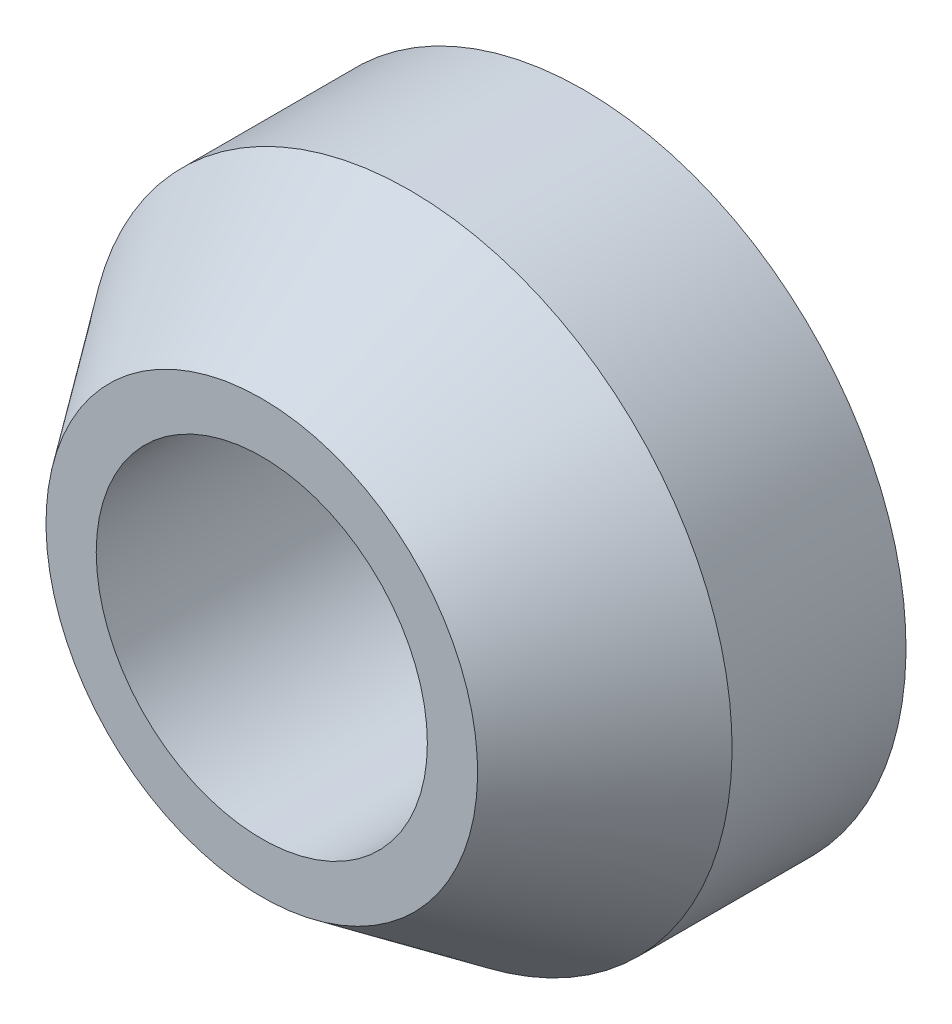
ISO-10303-21;
HEADER;
FILE_DESCRIPTION(('STEP AP214'),'2;1');
FILE_NAME('part.step','',(''),(''),'','','');
FILE_SCHEMA(('AUTOMOTIVE_DESIGN { 1 0 10303 214 1 1 1 1 }'));
ENDSEC;
DATA;
#1=APPLICATION_CONTEXT('core data for automotive mechanical design processes');
#2=APPLICATION_PROTOCOL_DEFINITION('international standard','automotive_design',2000,#1);
#3=PRODUCT_CONTEXT('',#1,'mechanical');
#4=PRODUCT('Part','Part','',(#3));
#5=PRODUCT_RELATED_PRODUCT_CATEGORY('part','',(#4));
#6=PRODUCT_DEFINITION_FORMATION('','',#4);
#7=PRODUCT_DEFINITION_CONTEXT('part definition',#1,'design');
#8=PRODUCT_DEFINITION('design','',#6,#7);
#9=PRODUCT_DEFINITION_SHAPE('','',#8);
#10=(LENGTH_UNIT() NAMED_UNIT(*) SI_UNIT(.MILLI.,.METRE.));
#11=(NAMED_UNIT(*) PLANE_ANGLE_UNIT() SI_UNIT($,.RADIAN.));
#12=(NAMED_UNIT(*) SI_UNIT($,.STERADIAN.) SOLID_ANGLE_UNIT());
#13=UNCERTAINTY_MEASURE_WITH_UNIT(LENGTH_MEASURE(1.E-05),#10,'distance_accuracy_value','');
#14=(GEOMETRIC_REPRESENTATION_CONTEXT(3) GLOBAL_UNCERTAINTY_ASSIGNED_CONTEXT((#13)) GLOBAL_UNIT_ASSIGNED_CONTEXT((#10,
#11,#12)) REPRESENTATION_CONTEXT('',''));
#15=CARTESIAN_POINT('',(0.,0.,0.));
#16=DIRECTION('',(0.,0.,1.));
#17=DIRECTION('',(1.,0.,0.));
#18=AXIS2_PLACEMENT_3D('',#15,#16,#17);
#19=CARTESIAN_POINT('',(0.,0.,6.35));
#20=DIRECTION('',(0.,0.,1.));
#21=DIRECTION('',(0.,-1.,0.));
#22=AXIS2_PLACEMENT_3D('',#19,#20,#21);
#23=PLANE('',#22);
#24=CARTESIAN_POINT('',(0.,0.,6.35));
#25=DIRECTION('',(0.,0.,1.));
#26=DIRECTION('',(1.,0.,0.));
#27=AXIS2_PLACEMENT_3D('',#24,#25,#26);
#28=CIRCLE('',#27,3.26389999999999);
#29=CARTESIAN_POINT('',(3.26389999999999,0.,6.35));
#30=VERTEX_POINT('',#29);
#31=EDGE_CURVE('E60',#30,#30,#28,.T.);
#32=ORIENTED_EDGE('',*,*,#31,.F.);
#33=EDGE_LOOP('',(#32));
#34=FACE_BOUND('',#33,.T.);
#35=CARTESIAN_POINT('',(0.,0.,6.35));
#36=DIRECTION('',(0.,0.,-1.));
#37=DIRECTION('',(0.,1.,0.));
#38=AXIS2_PLACEMENT_3D('',#35,#36,#37);
#39=CIRCLE('',#38,4.2545);
#40=CARTESIAN_POINT('',(0.,4.2545,6.35));
#41=VERTEX_POINT('',#40);
#42=EDGE_CURVE('E10',#41,#41,#39,.T.);
#43=ORIENTED_EDGE('',*,*,#42,.F.);
#44=EDGE_LOOP('',(#43));
#45=FACE_BOUND('',#44,.T.);
#46=ADVANCED_FACE('F36',(#34,#45),#23,.T.);
#47=CARTESIAN_POINT('',(0.,0.,3.429));
#48=DIRECTION('',(0.,0.,-1.));
#49=DIRECTION('',(0.,1.,0.));
#50=AXIS2_PLACEMENT_3D('',#47,#48,#49);
#51=CONICAL_SURFACE('',#50,6.35,0.622302871187207);
#52=ORIENTED_EDGE('',*,*,#42,.T.);
#53=EDGE_LOOP('',(#52));
#54=FACE_BOUND('',#53,.T.);
#55=CARTESIAN_POINT('',(0.,0.,3.429));
#56=DIRECTION('',(0.,0.,-1.));
#57=DIRECTION('',(0.,1.,0.));
#58=AXIS2_PLACEMENT_3D('',#55,#56,#57);
#59=CIRCLE('',#58,6.35);
#60=CARTESIAN_POINT('',(0.,6.35,3.429));
#61=VERTEX_POINT('',#60);
#62=EDGE_CURVE('E43',#61,#61,#59,.T.);
#63=ORIENTED_EDGE('',*,*,#62,.F.);
#64=EDGE_LOOP('',(#63));
#65=FACE_BOUND('',#64,.T.);
#66=ADVANCED_FACE('F68',(#54,#65),#51,.T.);
#67=CARTESIAN_POINT('',(0.,0.,0.));
#68=DIRECTION('',(0.,0.,-1.));
#69=DIRECTION('',(0.,1.,0.));
#70=AXIS2_PLACEMENT_3D('',#67,#68,#69);
#71=CYLINDRICAL_SURFACE('',#70,6.35);
#72=ORIENTED_EDGE('',*,*,#62,.T.);
#73=EDGE_LOOP('',(#72));
#74=FACE_BOUND('',#73,.T.);
#75=CARTESIAN_POINT('',(0.,0.,0.));
#76=DIRECTION('',(0.,0.,-1.));
#77=DIRECTION('',(0.,1.,0.));
#78=AXIS2_PLACEMENT_3D('',#75,#76,#77);
#79=CIRCLE('',#78,6.35);
#80=CARTESIAN_POINT('',(0.,6.35,0.));
#81=VERTEX_POINT('',#80);
#82=EDGE_CURVE('E49',#81,#81,#79,.T.);
#83=ORIENTED_EDGE('',*,*,#82,.F.);
#84=EDGE_LOOP('',(#83));
#85=FACE_BOUND('',#84,.T.);
#86=ADVANCED_FACE('F72',(#74,#85),#71,.T.);
#87=CARTESIAN_POINT('',(0.,6.35,0.));
#88=DIRECTION('',(0.,0.,-1.));
#89=DIRECTION('',(0.,1.,0.));
#90=AXIS2_PLACEMENT_3D('',#87,#88,#89);
#91=PLANE('',#90);
#92=CARTESIAN_POINT('',(0.,0.,0.));
#93=DIRECTION('',(0.,0.,1.));
#94=DIRECTION('',(1.,0.,0.));
#95=AXIS2_PLACEMENT_3D('',#92,#93,#94);
#96=CIRCLE('',#95,3.2639);
#97=CARTESIAN_POINT('',(3.2639,0.,0.));
#98=VERTEX_POINT('',#97);
#99=EDGE_CURVE('E54',#98,#98,#96,.T.);
#100=ORIENTED_EDGE('',*,*,#99,.T.);
#101=EDGE_LOOP('',(#100));
#102=FACE_BOUND('',#101,.T.);
#103=ORIENTED_EDGE('',*,*,#82,.T.);
#104=EDGE_LOOP('',(#103));
#105=FACE_BOUND('',#104,.T.);
#106=ADVANCED_FACE('F76',(#102,#105),#91,.T.);
#107=CARTESIAN_POINT('',(0.,0.,6.35));
#108=DIRECTION('',(0.,0.,1.));
#109=DIRECTION('',(1.,0.,0.));
#110=AXIS2_PLACEMENT_3D('',#107,#108,#109);
#111=CYLINDRICAL_SURFACE('',#110,3.26389999999999);
#112=ORIENTED_EDGE('',*,*,#99,.F.);
#113=EDGE_LOOP('',(#112));
#114=FACE_BOUND('',#113,.T.);
#115=ORIENTED_EDGE('',*,*,#31,.T.);
#116=EDGE_LOOP('',(#115));
#117=FACE_BOUND('',#116,.T.);
#118=ADVANCED_FACE('F64',(#114,#117),#111,.F.);
#119=CLOSED_SHELL('',(#46,#66,#86,#106,#118));
#120=MANIFOLD_SOLID_BREP('B2',#119);
#121=ADVANCED_BREP_SHAPE_REPRESENTATION('',(#18,#120),#14);
#122=SHAPE_DEFINITION_REPRESENTATION(#9,#121);
ENDSEC;
END-ISO-10303-21;
